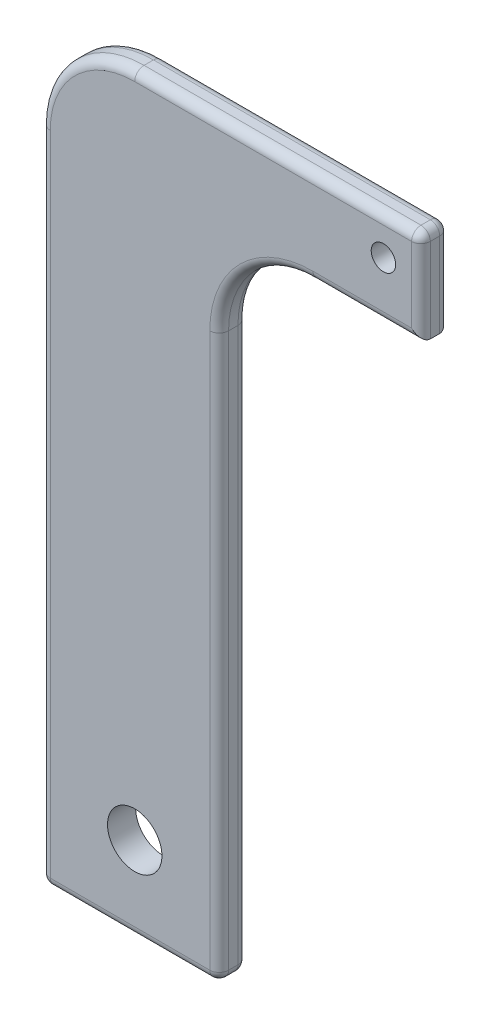
ISO-10303-21;
HEADER;
FILE_DESCRIPTION(('STEP AP214'),'2;1');
FILE_NAME('part.step','',(''),(''),'','','');
FILE_SCHEMA(('AUTOMOTIVE_DESIGN { 1 0 10303 214 1 1 1 1 }'));
ENDSEC;
DATA;
#1=APPLICATION_CONTEXT('core data for automotive mechanical design processes');
#2=APPLICATION_PROTOCOL_DEFINITION('international standard','automotive_design',2000,#1);
#3=PRODUCT_CONTEXT('',#1,'mechanical');
#4=PRODUCT('Part','Part','',(#3));
#5=PRODUCT_RELATED_PRODUCT_CATEGORY('part','',(#4));
#6=PRODUCT_DEFINITION_FORMATION('','',#4);
#7=PRODUCT_DEFINITION_CONTEXT('part definition',#1,'design');
#8=PRODUCT_DEFINITION('design','',#6,#7);
#9=PRODUCT_DEFINITION_SHAPE('','',#8);
#10=(LENGTH_UNIT() NAMED_UNIT(*) SI_UNIT(.MILLI.,.METRE.));
#11=(NAMED_UNIT(*) PLANE_ANGLE_UNIT() SI_UNIT($,.RADIAN.));
#12=(NAMED_UNIT(*) SI_UNIT($,.STERADIAN.) SOLID_ANGLE_UNIT());
#13=UNCERTAINTY_MEASURE_WITH_UNIT(LENGTH_MEASURE(1.E-05),#10,'distance_accuracy_value','');
#14=(GEOMETRIC_REPRESENTATION_CONTEXT(3) GLOBAL_UNCERTAINTY_ASSIGNED_CONTEXT((#13)) GLOBAL_UNIT_ASSIGNED_CONTEXT((#10,
#11,#12)) REPRESENTATION_CONTEXT('',''));
#15=CARTESIAN_POINT('',(0.,0.,0.));
#16=DIRECTION('',(0.,0.,1.));
#17=DIRECTION('',(1.,0.,0.));
#18=AXIS2_PLACEMENT_3D('',#15,#16,#17);
#19=CARTESIAN_POINT('',(0.,0.,26.));
#20=DIRECTION('',(-1.,0.,0.));
#21=DIRECTION('',(0.,-1.,0.));
#22=AXIS2_PLACEMENT_3D('',#19,#20,#21);
#23=PLANE('',#22);
#24=DIRECTION('',(0.,0.,-1.));
#25=VECTOR('',#24,1.);
#26=CARTESIAN_POINT('',(0.,147.,23.));
#27=LINE('',#26,#25);
#28=CARTESIAN_POINT('',(0.,147.,25.));
#29=VERTEX_POINT('',#28);
#30=CARTESIAN_POINT('',(0.,147.,24.));
#31=VERTEX_POINT('',#30);
#32=EDGE_CURVE('E245',#29,#31,#27,.T.);
#33=ORIENTED_EDGE('',*,*,#32,.T.);
#34=DIRECTION('',(0.,1.,0.));
#35=VECTOR('',#34,1.);
#36=CARTESIAN_POINT('',(0.,77.,24.));
#37=LINE('',#36,#35);
#38=CARTESIAN_POINT('',(0.,78.,24.));
#39=VERTEX_POINT('',#38);
#40=EDGE_CURVE('E263',#31,#39,#37,.F.);
#41=ORIENTED_EDGE('',*,*,#40,.T.);
#42=DIRECTION('',(0.,0.,-1.));
#43=VECTOR('',#42,1.);
#44=CARTESIAN_POINT('',(0.,78.,26.));
#45=LINE('',#44,#43);
#46=CARTESIAN_POINT('',(0.,78.,25.));
#47=VERTEX_POINT('',#46);
#48=EDGE_CURVE('E259',#39,#47,#45,.F.);
#49=ORIENTED_EDGE('',*,*,#48,.T.);
#50=DIRECTION('',(0.,1.,0.));
#51=VECTOR('',#50,1.);
#52=CARTESIAN_POINT('',(0.,0.,25.));
#53=LINE('',#52,#51);
#54=EDGE_CURVE('E261',#47,#29,#53,.T.);
#55=ORIENTED_EDGE('',*,*,#54,.T.);
#56=EDGE_LOOP('',(#33,#41,#49,#55));
#57=FACE_BOUND('',#56,.T.);
#58=ADVANCED_FACE('F39',(#57),#23,.T.);
#59=CARTESIAN_POINT('',(0.,77.,26.));
#60=DIRECTION('',(0.,1.,0.));
#61=DIRECTION('',(0.,0.,1.));
#62=AXIS2_PLACEMENT_3D('',#59,#60,#61);
#63=PLANE('',#62);
#64=DIRECTION('',(1.,0.,0.));
#65=VECTOR('',#64,1.);
#66=CARTESIAN_POINT('',(0.,77.,25.));
#67=LINE('',#66,#65);
#68=CARTESIAN_POINT('',(18.,77.,25.));
#69=VERTEX_POINT('',#68);
#70=CARTESIAN_POINT('',(1.,77.,25.));
#71=VERTEX_POINT('',#70);
#72=EDGE_CURVE('E298',#69,#71,#67,.F.);
#73=ORIENTED_EDGE('',*,*,#72,.T.);
#74=DIRECTION('',(0.,0.,-1.));
#75=VECTOR('',#74,1.);
#76=CARTESIAN_POINT('',(1.,77.,23.));
#77=LINE('',#76,#75);
#78=CARTESIAN_POINT('',(1.,77.,24.));
#79=VERTEX_POINT('',#78);
#80=EDGE_CURVE('E304',#71,#79,#77,.T.);
#81=ORIENTED_EDGE('',*,*,#80,.T.);
#82=DIRECTION('',(1.,0.,0.));
#83=VECTOR('',#82,1.);
#84=CARTESIAN_POINT('',(0.,77.,24.));
#85=LINE('',#84,#83);
#86=CARTESIAN_POINT('',(18.,77.,24.));
#87=VERTEX_POINT('',#86);
#88=EDGE_CURVE('E302',#79,#87,#85,.T.);
#89=ORIENTED_EDGE('',*,*,#88,.T.);
#90=DIRECTION('',(0.,0.,-1.));
#91=VECTOR('',#90,1.);
#92=CARTESIAN_POINT('',(18.,77.,26.));
#93=LINE('',#92,#91);
#94=EDGE_CURVE('E300',#87,#69,#93,.F.);
#95=ORIENTED_EDGE('',*,*,#94,.T.);
#96=EDGE_LOOP('',(#73,#81,#89,#95));
#97=FACE_BOUND('',#96,.T.);
#98=ADVANCED_FACE('F478',(#97),#63,.F.);
#99=CARTESIAN_POINT('',(19.,0.,26.));
#100=DIRECTION('',(-1.,0.,0.));
#101=DIRECTION('',(0.,-1.,0.));
#102=AXIS2_PLACEMENT_3D('',#99,#100,#101);
#103=PLANE('',#102);
#104=DIRECTION('',(0.,0.,-1.));
#105=VECTOR('',#104,1.);
#106=CARTESIAN_POINT('',(19.,78.,26.));
#107=LINE('',#106,#105);
#108=CARTESIAN_POINT('',(19.,78.,25.));
#109=VERTEX_POINT('',#108);
#110=CARTESIAN_POINT('',(19.,78.,24.));
#111=VERTEX_POINT('',#110);
#112=EDGE_CURVE('E275',#109,#111,#107,.T.);
#113=ORIENTED_EDGE('',*,*,#112,.T.);
#114=DIRECTION('',(0.,1.,0.));
#115=VECTOR('',#114,1.);
#116=CARTESIAN_POINT('',(19.,0.,24.));
#117=LINE('',#116,#115);
#118=CARTESIAN_POINT('',(19.,137.,24.));
#119=VERTEX_POINT('',#118);
#120=EDGE_CURVE('E279',#111,#119,#117,.T.);
#121=ORIENTED_EDGE('',*,*,#120,.T.);
#122=DIRECTION('',(0.,0.,-1.));
#123=VECTOR('',#122,1.);
#124=CARTESIAN_POINT('',(19.,137.,26.));
#125=LINE('',#124,#123);
#126=CARTESIAN_POINT('',(19.,137.,25.));
#127=VERTEX_POINT('',#126);
#128=EDGE_CURVE('E242',#119,#127,#125,.F.);
#129=ORIENTED_EDGE('',*,*,#128,.T.);
#130=DIRECTION('',(0.,1.,0.));
#131=VECTOR('',#130,1.);
#132=CARTESIAN_POINT('',(19.,77.,25.));
#133=LINE('',#132,#131);
#134=EDGE_CURVE('E277',#127,#109,#133,.F.);
#135=ORIENTED_EDGE('',*,*,#134,.T.);
#136=EDGE_LOOP('',(#113,#121,#129,#135));
#137=FACE_BOUND('',#136,.T.);
#138=ADVANCED_FACE('F401',(#137),#103,.F.);
#139=CARTESIAN_POINT('',(0.,147.,26.));
#140=DIRECTION('',(0.,1.,0.));
#141=DIRECTION('',(0.,0.,1.));
#142=AXIS2_PLACEMENT_3D('',#139,#140,#141);
#143=PLANE('',#142);
#144=DIRECTION('',(0.,0.,-1.));
#145=VECTOR('',#144,1.);
#146=CARTESIAN_POINT('',(29.,147.,23.));
#147=LINE('',#146,#145);
#148=CARTESIAN_POINT('',(29.,147.,25.));
#149=VERTEX_POINT('',#148);
#150=CARTESIAN_POINT('',(29.,147.,24.));
#151=VERTEX_POINT('',#150);
#152=EDGE_CURVE('E239',#149,#151,#147,.T.);
#153=ORIENTED_EDGE('',*,*,#152,.T.);
#154=DIRECTION('',(1.,0.,0.));
#155=VECTOR('',#154,1.);
#156=CARTESIAN_POINT('',(0.,147.,24.));
#157=LINE('',#156,#155);
#158=CARTESIAN_POINT('',(40.5,147.,24.));
#159=VERTEX_POINT('',#158);
#160=EDGE_CURVE('E197',#151,#159,#157,.T.);
#161=ORIENTED_EDGE('',*,*,#160,.T.);
#162=DIRECTION('',(0.,0.,-1.));
#163=VECTOR('',#162,1.);
#164=CARTESIAN_POINT('',(40.5,147.,26.));
#165=LINE('',#164,#163);
#166=CARTESIAN_POINT('',(40.5,147.,25.));
#167=VERTEX_POINT('',#166);
#168=EDGE_CURVE('E237',#167,#159,#165,.T.);
#169=ORIENTED_EDGE('',*,*,#168,.F.);
#170=DIRECTION('',(1.,0.,0.));
#171=VECTOR('',#170,1.);
#172=CARTESIAN_POINT('',(29.,147.,25.));
#173=LINE('',#172,#171);
#174=EDGE_CURVE('E272',#167,#149,#173,.F.);
#175=ORIENTED_EDGE('',*,*,#174,.T.);
#176=EDGE_LOOP('',(#153,#161,#169,#175));
#177=FACE_BOUND('',#176,.T.);
#178=ADVANCED_FACE('F389',(#177),#143,.F.);
#179=CARTESIAN_POINT('',(40.5,0.,26.));
#180=DIRECTION('',(-1.,0.,0.));
#181=DIRECTION('',(0.,0.,1.));
#182=AXIS2_PLACEMENT_3D('',#179,#180,#181);
#183=PLANE('',#182);
#184=ORIENTED_EDGE('',*,*,#168,.T.);
#185=DIRECTION('',(0.,1.,0.));
#186=VECTOR('',#185,1.);
#187=CARTESIAN_POINT('',(40.5,0.,24.));
#188=LINE('',#187,#186);
#189=CARTESIAN_POINT('',(40.5,156.,24.));
#190=VERTEX_POINT('',#189);
#191=EDGE_CURVE('E56',#159,#190,#188,.T.);
#192=ORIENTED_EDGE('',*,*,#191,.T.);
#193=DIRECTION('',(0.,0.,-1.));
#194=VECTOR('',#193,1.);
#195=CARTESIAN_POINT('',(40.5,156.,26.));
#196=LINE('',#195,#194);
#197=CARTESIAN_POINT('',(40.5,156.,25.));
#198=VERTEX_POINT('',#197);
#199=EDGE_CURVE('E60',#190,#198,#196,.F.);
#200=ORIENTED_EDGE('',*,*,#199,.T.);
#201=DIRECTION('',(0.,1.,0.));
#202=VECTOR('',#201,1.);
#203=CARTESIAN_POINT('',(40.5,147.,25.));
#204=LINE('',#203,#202);
#205=EDGE_CURVE('E307',#198,#167,#204,.F.);
#206=ORIENTED_EDGE('',*,*,#205,.T.);
#207=EDGE_LOOP('',(#184,#192,#200,#206));
#208=FACE_BOUND('',#207,.T.);
#209=ADVANCED_FACE('F387',(#208),#183,.F.);
#210=CARTESIAN_POINT('',(10.,86.,26.));
#211=DIRECTION('',(0.,0.,-1.));
#212=DIRECTION('',(-1.,0.,0.));
#213=AXIS2_PLACEMENT_3D('',#210,#211,#212);
#214=CYLINDRICAL_SURFACE('',#213,2.9);
#215=CARTESIAN_POINT('',(10.,86.,26.));
#216=DIRECTION('',(0.,0.,1.));
#217=DIRECTION('',(1.,0.,0.));
#218=AXIS2_PLACEMENT_3D('',#215,#216,#217);
#219=CIRCLE('',#218,2.9);
#220=CARTESIAN_POINT('',(12.9,86.,26.));
#221=VERTEX_POINT('',#220);
#222=EDGE_CURVE('E231',#221,#221,#219,.F.);
#223=ORIENTED_EDGE('',*,*,#222,.F.);
#224=EDGE_LOOP('',(#223));
#225=FACE_BOUND('',#224,.T.);
#226=CARTESIAN_POINT('',(10.,86.,23.));
#227=DIRECTION('',(0.,0.,1.));
#228=DIRECTION('',(1.,0.,0.));
#229=AXIS2_PLACEMENT_3D('',#226,#227,#228);
#230=CIRCLE('',#229,2.9);
#231=CARTESIAN_POINT('',(12.9,86.,23.));
#232=VERTEX_POINT('',#231);
#233=EDGE_CURVE('E220',#232,#232,#230,.F.);
#234=ORIENTED_EDGE('',*,*,#233,.T.);
#235=EDGE_LOOP('',(#234));
#236=FACE_BOUND('',#235,.T.);
#237=ADVANCED_FACE('F780',(#225,#236),#214,.F.);
#238=CARTESIAN_POINT('',(0.,157.,26.));
#239=DIRECTION('',(0.,-1.,0.));
#240=DIRECTION('',(0.,0.,-1.));
#241=AXIS2_PLACEMENT_3D('',#238,#239,#240);
#242=PLANE('',#241);
#243=DIRECTION('',(0.,0.,-1.));
#244=VECTOR('',#243,1.);
#245=CARTESIAN_POINT('',(39.5,157.,26.));
#246=LINE('',#245,#244);
#247=CARTESIAN_POINT('',(39.5,157.,25.));
#248=VERTEX_POINT('',#247);
#249=CARTESIAN_POINT('',(39.5,157.,24.));
#250=VERTEX_POINT('',#249);
#251=EDGE_CURVE('E266',#248,#250,#246,.T.);
#252=ORIENTED_EDGE('',*,*,#251,.T.);
#253=DIRECTION('',(-1.,0.,0.));
#254=VECTOR('',#253,1.);
#255=CARTESIAN_POINT('',(0.,157.,24.));
#256=LINE('',#255,#254);
#257=CARTESIAN_POINT('',(10.,157.,24.));
#258=VERTEX_POINT('',#257);
#259=EDGE_CURVE('E270',#250,#258,#256,.T.);
#260=ORIENTED_EDGE('',*,*,#259,.T.);
#261=DIRECTION('',(0.,0.,-1.));
#262=VECTOR('',#261,1.);
#263=CARTESIAN_POINT('',(10.,157.,26.));
#264=LINE('',#263,#262);
#265=CARTESIAN_POINT('',(10.,157.,25.));
#266=VERTEX_POINT('',#265);
#267=EDGE_CURVE('E193',#258,#266,#264,.F.);
#268=ORIENTED_EDGE('',*,*,#267,.T.);
#269=DIRECTION('',(-1.,0.,0.));
#270=VECTOR('',#269,1.);
#271=CARTESIAN_POINT('',(40.5,157.,25.));
#272=LINE('',#271,#270);
#273=EDGE_CURVE('E268',#266,#248,#272,.F.);
#274=ORIENTED_EDGE('',*,*,#273,.T.);
#275=EDGE_LOOP('',(#252,#260,#268,#274));
#276=FACE_BOUND('',#275,.T.);
#277=ADVANCED_FACE('F445',(#276),#242,.F.);
#278=CARTESIAN_POINT('',(36.5,153.,26.));
#279=DIRECTION('',(0.,0.,-1.));
#280=DIRECTION('',(-1.,0.,0.));
#281=AXIS2_PLACEMENT_3D('',#278,#279,#280);
#282=CYLINDRICAL_SURFACE('',#281,1.3);
#283=CARTESIAN_POINT('',(36.5,153.,26.));
#284=DIRECTION('',(0.,0.,1.));
#285=DIRECTION('',(1.,0.,0.));
#286=AXIS2_PLACEMENT_3D('',#283,#284,#285);
#287=CIRCLE('',#286,1.3);
#288=CARTESIAN_POINT('',(37.8,153.,26.));
#289=VERTEX_POINT('',#288);
#290=EDGE_CURVE('E234',#289,#289,#287,.T.);
#291=ORIENTED_EDGE('',*,*,#290,.T.);
#292=EDGE_LOOP('',(#291));
#293=FACE_BOUND('',#292,.T.);
#294=CARTESIAN_POINT('',(36.5,153.,23.));
#295=DIRECTION('',(0.,0.,1.));
#296=DIRECTION('',(1.,0.,0.));
#297=AXIS2_PLACEMENT_3D('',#294,#295,#296);
#298=CIRCLE('',#297,1.3);
#299=CARTESIAN_POINT('',(37.8,153.,23.));
#300=VERTEX_POINT('',#299);
#301=EDGE_CURVE('E226',#300,#300,#298,.T.);
#302=ORIENTED_EDGE('',*,*,#301,.F.);
#303=EDGE_LOOP('',(#302));
#304=FACE_BOUND('',#303,.T.);
#305=ADVANCED_FACE('F768',(#293,#304),#282,.F.);
#306=CARTESIAN_POINT('',(0.,0.,26.));
#307=DIRECTION('',(0.,0.,1.));
#308=DIRECTION('',(1.,0.,0.));
#309=AXIS2_PLACEMENT_3D('',#306,#307,#308);
#310=PLANE('',#309);
#311=DIRECTION('',(-1.,0.,0.));
#312=VECTOR('',#311,1.);
#313=CARTESIAN_POINT('',(10.,156.,26.));
#314=LINE('',#313,#312);
#315=CARTESIAN_POINT('',(39.5,156.,26.));
#316=VERTEX_POINT('',#315);
#317=CARTESIAN_POINT('',(10.,156.,26.));
#318=VERTEX_POINT('',#317);
#319=EDGE_CURVE('E293',#316,#318,#314,.T.);
#320=ORIENTED_EDGE('',*,*,#319,.T.);
#321=CARTESIAN_POINT('',(10.,147.,26.));
#322=DIRECTION('',(0.,0.,1.));
#323=DIRECTION('',(1.,0.,0.));
#324=AXIS2_PLACEMENT_3D('',#321,#322,#323);
#325=CIRCLE('',#324,9.);
#326=CARTESIAN_POINT('',(0.999999999999996,147.,26.));
#327=VERTEX_POINT('',#326);
#328=EDGE_CURVE('E296',#318,#327,#325,.T.);
#329=ORIENTED_EDGE('',*,*,#328,.T.);
#330=DIRECTION('',(0.,1.,0.));
#331=VECTOR('',#330,1.);
#332=CARTESIAN_POINT('',(1.,0.,26.));
#333=LINE('',#332,#331);
#334=CARTESIAN_POINT('',(1.,78.,26.));
#335=VERTEX_POINT('',#334);
#336=EDGE_CURVE('E291',#327,#335,#333,.F.);
#337=ORIENTED_EDGE('',*,*,#336,.T.);
#338=DIRECTION('',(1.,0.,0.));
#339=VECTOR('',#338,1.);
#340=CARTESIAN_POINT('',(19.,78.,26.));
#341=LINE('',#340,#339);
#342=CARTESIAN_POINT('',(18.,78.,26.));
#343=VERTEX_POINT('',#342);
#344=EDGE_CURVE('E289',#335,#343,#341,.T.);
#345=ORIENTED_EDGE('',*,*,#344,.T.);
#346=DIRECTION('',(0.,1.,0.));
#347=VECTOR('',#346,1.);
#348=CARTESIAN_POINT('',(18.,137.,26.));
#349=LINE('',#348,#347);
#350=CARTESIAN_POINT('',(18.,137.,26.));
#351=VERTEX_POINT('',#350);
#352=EDGE_CURVE('E285',#343,#351,#349,.T.);
#353=ORIENTED_EDGE('',*,*,#352,.T.);
#354=CARTESIAN_POINT('',(29.,137.,26.));
#355=DIRECTION('',(0.,0.,1.));
#356=DIRECTION('',(1.,0.,0.));
#357=AXIS2_PLACEMENT_3D('',#354,#355,#356);
#358=CIRCLE('',#357,11.);
#359=CARTESIAN_POINT('',(29.,148.,26.));
#360=VERTEX_POINT('',#359);
#361=EDGE_CURVE('E281',#351,#360,#358,.F.);
#362=ORIENTED_EDGE('',*,*,#361,.T.);
#363=DIRECTION('',(1.,0.,0.));
#364=VECTOR('',#363,1.);
#365=CARTESIAN_POINT('',(40.5,148.,26.));
#366=LINE('',#365,#364);
#367=CARTESIAN_POINT('',(39.5,148.,26.));
#368=VERTEX_POINT('',#367);
#369=EDGE_CURVE('E283',#360,#368,#366,.T.);
#370=ORIENTED_EDGE('',*,*,#369,.T.);
#371=DIRECTION('',(0.,1.,0.));
#372=VECTOR('',#371,1.);
#373=CARTESIAN_POINT('',(39.5,157.,26.));
#374=LINE('',#373,#372);
#375=EDGE_CURVE('E287',#368,#316,#374,.T.);
#376=ORIENTED_EDGE('',*,*,#375,.T.);
#377=EDGE_LOOP('',(#320,#329,#337,#345,#353,#362,#370,#376));
#378=FACE_BOUND('',#377,.T.);
#379=ORIENTED_EDGE('',*,*,#222,.T.);
#380=EDGE_LOOP('',(#379));
#381=FACE_BOUND('',#380,.T.);
#382=ORIENTED_EDGE('',*,*,#290,.F.);
#383=EDGE_LOOP('',(#382));
#384=FACE_BOUND('',#383,.T.);
#385=ADVANCED_FACE('F392',(#378,#381,#384),#310,.T.);
#386=CARTESIAN_POINT('',(0.,0.,23.));
#387=DIRECTION('',(0.,0.,1.));
#388=DIRECTION('',(1.,0.,0.));
#389=AXIS2_PLACEMENT_3D('',#386,#387,#388);
#390=PLANE('',#389);
#391=DIRECTION('',(0.,1.,0.));
#392=VECTOR('',#391,1.);
#393=CARTESIAN_POINT('',(0.999999999999996,147.,23.));
#394=LINE('',#393,#392);
#395=CARTESIAN_POINT('',(1.,78.,23.));
#396=VERTEX_POINT('',#395);
#397=CARTESIAN_POINT('',(0.999999999999996,147.,23.));
#398=VERTEX_POINT('',#397);
#399=EDGE_CURVE('E255',#396,#398,#394,.T.);
#400=ORIENTED_EDGE('',*,*,#399,.T.);
#401=CARTESIAN_POINT('',(10.,147.,23.));
#402=DIRECTION('',(0.,0.,1.));
#403=DIRECTION('',(1.,0.,0.));
#404=AXIS2_PLACEMENT_3D('',#401,#402,#403);
#405=CIRCLE('',#404,9.);
#406=CARTESIAN_POINT('',(10.,156.,23.));
#407=VERTEX_POINT('',#406);
#408=EDGE_CURVE('E257',#398,#407,#405,.F.);
#409=ORIENTED_EDGE('',*,*,#408,.T.);
#410=DIRECTION('',(-1.,0.,0.));
#411=VECTOR('',#410,1.);
#412=CARTESIAN_POINT('',(0.,156.,23.));
#413=LINE('',#412,#411);
#414=CARTESIAN_POINT('',(39.5,156.,23.));
#415=VERTEX_POINT('',#414);
#416=EDGE_CURVE('E253',#407,#415,#413,.F.);
#417=ORIENTED_EDGE('',*,*,#416,.T.);
#418=DIRECTION('',(0.,1.,0.));
#419=VECTOR('',#418,1.);
#420=CARTESIAN_POINT('',(39.5,0.,23.));
#421=LINE('',#420,#419);
#422=CARTESIAN_POINT('',(39.5,148.,23.));
#423=VERTEX_POINT('',#422);
#424=EDGE_CURVE('E176',#415,#423,#421,.F.);
#425=ORIENTED_EDGE('',*,*,#424,.T.);
#426=DIRECTION('',(1.,0.,0.));
#427=VECTOR('',#426,1.);
#428=CARTESIAN_POINT('',(0.,148.,23.));
#429=LINE('',#428,#427);
#430=CARTESIAN_POINT('',(29.,148.,23.));
#431=VERTEX_POINT('',#430);
#432=EDGE_CURVE('E168',#423,#431,#429,.F.);
#433=ORIENTED_EDGE('',*,*,#432,.T.);
#434=CARTESIAN_POINT('',(29.,137.,23.));
#435=DIRECTION('',(0.,0.,1.));
#436=DIRECTION('',(1.,0.,0.));
#437=AXIS2_PLACEMENT_3D('',#434,#435,#436);
#438=CIRCLE('',#437,11.);
#439=CARTESIAN_POINT('',(18.,137.,23.));
#440=VERTEX_POINT('',#439);
#441=EDGE_CURVE('E173',#431,#440,#438,.T.);
#442=ORIENTED_EDGE('',*,*,#441,.T.);
#443=DIRECTION('',(0.,1.,0.));
#444=VECTOR('',#443,1.);
#445=CARTESIAN_POINT('',(18.,0.,23.));
#446=LINE('',#445,#444);
#447=CARTESIAN_POINT('',(18.,78.,23.));
#448=VERTEX_POINT('',#447);
#449=EDGE_CURVE('E182',#440,#448,#446,.F.);
#450=ORIENTED_EDGE('',*,*,#449,.T.);
#451=DIRECTION('',(1.,0.,0.));
#452=VECTOR('',#451,1.);
#453=CARTESIAN_POINT('',(0.,78.,23.));
#454=LINE('',#453,#452);
#455=EDGE_CURVE('E181',#448,#396,#454,.F.);
#456=ORIENTED_EDGE('',*,*,#455,.T.);
#457=EDGE_LOOP('',(#400,#409,#417,#425,#433,#442,#450,#456));
#458=FACE_BOUND('',#457,.T.);
#459=ORIENTED_EDGE('',*,*,#233,.F.);
#460=EDGE_LOOP('',(#459));
#461=FACE_BOUND('',#460,.T.);
#462=ORIENTED_EDGE('',*,*,#301,.T.);
#463=EDGE_LOOP('',(#462));
#464=FACE_BOUND('',#463,.T.);
#465=ADVANCED_FACE('F171',(#458,#461,#464),#390,.F.);
#466=CARTESIAN_POINT('',(29.,137.,26.));
#467=DIRECTION('',(0.,0.,1.));
#468=DIRECTION('',(1.,0.,0.));
#469=AXIS2_PLACEMENT_3D('',#466,#467,#468);
#470=CYLINDRICAL_SURFACE('',#469,10.);
#471=ORIENTED_EDGE('',*,*,#128,.F.);
#472=CARTESIAN_POINT('',(29.,137.,24.));
#473=DIRECTION('',(0.,0.,1.));
#474=DIRECTION('',(1.,0.,0.));
#475=AXIS2_PLACEMENT_3D('',#472,#473,#474);
#476=CIRCLE('',#475,10.);
#477=EDGE_CURVE('E11',#119,#151,#476,.F.);
#478=ORIENTED_EDGE('',*,*,#477,.T.);
#479=ORIENTED_EDGE('',*,*,#152,.F.);
#480=CARTESIAN_POINT('',(29.,137.,25.));
#481=DIRECTION('',(0.,0.,1.));
#482=DIRECTION('',(1.,0.,0.));
#483=AXIS2_PLACEMENT_3D('',#480,#481,#482);
#484=CIRCLE('',#483,10.);
#485=EDGE_CURVE('E48',#149,#127,#484,.T.);
#486=ORIENTED_EDGE('',*,*,#485,.T.);
#487=EDGE_LOOP('',(#471,#478,#479,#486));
#488=FACE_BOUND('',#487,.T.);
#489=ADVANCED_FACE('F399',(#488),#470,.F.);
#490=CARTESIAN_POINT('',(10.,147.,26.));
#491=DIRECTION('',(0.,0.,1.));
#492=DIRECTION('',(1.,0.,0.));
#493=AXIS2_PLACEMENT_3D('',#490,#491,#492);
#494=CYLINDRICAL_SURFACE('',#493,10.);
#495=ORIENTED_EDGE('',*,*,#267,.F.);
#496=CARTESIAN_POINT('',(10.,147.,24.));
#497=DIRECTION('',(0.,0.,1.));
#498=DIRECTION('',(1.,0.,0.));
#499=AXIS2_PLACEMENT_3D('',#496,#497,#498);
#500=CIRCLE('',#499,10.);
#501=EDGE_CURVE('E313',#258,#31,#500,.T.);
#502=ORIENTED_EDGE('',*,*,#501,.T.);
#503=ORIENTED_EDGE('',*,*,#32,.F.);
#504=CARTESIAN_POINT('',(10.,147.,25.));
#505=DIRECTION('',(0.,0.,1.));
#506=DIRECTION('',(1.,0.,0.));
#507=AXIS2_PLACEMENT_3D('',#504,#505,#506);
#508=CIRCLE('',#507,10.);
#509=EDGE_CURVE('E311',#29,#266,#508,.F.);
#510=ORIENTED_EDGE('',*,*,#509,.T.);
#511=EDGE_LOOP('',(#495,#502,#503,#510));
#512=FACE_BOUND('',#511,.T.);
#513=ADVANCED_FACE('F448',(#512),#494,.T.);
#514=CARTESIAN_POINT('',(29.,137.,25.));
#515=DIRECTION('',(0.,0.,1.));
#516=DIRECTION('',(1.,0.,0.));
#517=AXIS2_PLACEMENT_3D('',#514,#515,#516);
#518=TOROIDAL_SURFACE('',#517,11.,1.);
#519=CARTESIAN_POINT('',(18.,137.,25.));
#520=DIRECTION('',(0.,-1.,0.));
#521=DIRECTION('',(0.,0.,-1.));
#522=AXIS2_PLACEMENT_3D('',#519,#520,#521);
#523=CIRCLE('',#522,1.);
#524=EDGE_CURVE('E213',#127,#351,#523,.T.);
#525=ORIENTED_EDGE('',*,*,#524,.F.);
#526=ORIENTED_EDGE('',*,*,#485,.F.);
#527=CARTESIAN_POINT('',(29.,148.,25.));
#528=DIRECTION('',(1.,0.,0.));
#529=DIRECTION('',(0.,0.,-1.));
#530=AXIS2_PLACEMENT_3D('',#527,#528,#529);
#531=CIRCLE('',#530,1.);
#532=EDGE_CURVE('E43',#360,#149,#531,.T.);
#533=ORIENTED_EDGE('',*,*,#532,.F.);
#534=ORIENTED_EDGE('',*,*,#361,.F.);
#535=EDGE_LOOP('',(#525,#526,#533,#534));
#536=FACE_BOUND('',#535,.T.);
#537=ADVANCED_FACE('F41',(#536),#518,.T.);
#538=CARTESIAN_POINT('',(0.,148.,25.));
#539=DIRECTION('',(-1.,0.,0.));
#540=DIRECTION('',(0.,0.,1.));
#541=AXIS2_PLACEMENT_3D('',#538,#539,#540);
#542=CYLINDRICAL_SURFACE('',#541,1.);
#543=ORIENTED_EDGE('',*,*,#532,.T.);
#544=ORIENTED_EDGE('',*,*,#174,.F.);
#545=CARTESIAN_POINT('',(39.5,148.,25.));
#546=DIRECTION('',(-0.707106781186547,-0.707106781186547,0.));
#547=DIRECTION('',(0.707106781186547,-0.707106781186547,0.));
#548=AXIS2_PLACEMENT_3D('',#545,#546,#547);
#549=ELLIPSE('',#548,1.41421356237309,1.);
#550=EDGE_CURVE('E211',#368,#167,#549,.F.);
#551=ORIENTED_EDGE('',*,*,#550,.F.);
#552=ORIENTED_EDGE('',*,*,#369,.F.);
#553=EDGE_LOOP('',(#543,#544,#551,#552));
#554=FACE_BOUND('',#553,.T.);
#555=ADVANCED_FACE('F391',(#554),#542,.T.);
#556=CARTESIAN_POINT('',(18.,0.,25.));
#557=DIRECTION('',(0.,-1.,0.));
#558=DIRECTION('',(1.,0.,0.));
#559=AXIS2_PLACEMENT_3D('',#556,#557,#558);
#560=CYLINDRICAL_SURFACE('',#559,1.);
#561=ORIENTED_EDGE('',*,*,#524,.T.);
#562=ORIENTED_EDGE('',*,*,#352,.F.);
#563=CARTESIAN_POINT('',(18.,78.,25.));
#564=DIRECTION('',(0.,-1.,0.));
#565=DIRECTION('',(0.,0.,-1.));
#566=AXIS2_PLACEMENT_3D('',#563,#564,#565);
#567=CIRCLE('',#566,1.);
#568=EDGE_CURVE('E198',#109,#343,#567,.T.);
#569=ORIENTED_EDGE('',*,*,#568,.F.);
#570=ORIENTED_EDGE('',*,*,#134,.F.);
#571=EDGE_LOOP('',(#561,#562,#569,#570));
#572=FACE_BOUND('',#571,.T.);
#573=ADVANCED_FACE('F469',(#572),#560,.T.);
#574=CARTESIAN_POINT('',(39.5,0.,25.));
#575=DIRECTION('',(0.,-1.,0.));
#576=DIRECTION('',(0.,0.,-1.));
#577=AXIS2_PLACEMENT_3D('',#574,#575,#576);
#578=CYLINDRICAL_SURFACE('',#577,1.);
#579=ORIENTED_EDGE('',*,*,#550,.T.);
#580=ORIENTED_EDGE('',*,*,#205,.F.);
#581=CARTESIAN_POINT('',(39.5,156.,25.));
#582=DIRECTION('',(0.,1.,0.));
#583=DIRECTION('',(0.,0.,1.));
#584=AXIS2_PLACEMENT_3D('',#581,#582,#583);
#585=CIRCLE('',#584,1.);
#586=EDGE_CURVE('E199',#316,#198,#585,.T.);
#587=ORIENTED_EDGE('',*,*,#586,.F.);
#588=ORIENTED_EDGE('',*,*,#375,.F.);
#589=EDGE_LOOP('',(#579,#580,#587,#588));
#590=FACE_BOUND('',#589,.T.);
#591=ADVANCED_FACE('F384',(#590),#578,.T.);
#592=CARTESIAN_POINT('',(0.,156.,25.));
#593=DIRECTION('',(1.,0.,0.));
#594=DIRECTION('',(0.,0.,-1.));
#595=AXIS2_PLACEMENT_3D('',#592,#593,#594);
#596=CYLINDRICAL_SURFACE('',#595,1.);
#597=CARTESIAN_POINT('',(39.5,156.,25.));
#598=DIRECTION('',(1.,0.,0.));
#599=DIRECTION('',(0.,0.,-1.));
#600=AXIS2_PLACEMENT_3D('',#597,#598,#599);
#601=CIRCLE('',#600,1.);
#602=EDGE_CURVE('E205',#248,#316,#601,.T.);
#603=ORIENTED_EDGE('',*,*,#602,.F.);
#604=ORIENTED_EDGE('',*,*,#273,.F.);
#605=CARTESIAN_POINT('',(10.,156.,25.));
#606=DIRECTION('',(-1.,0.,0.));
#607=DIRECTION('',(0.,0.,1.));
#608=AXIS2_PLACEMENT_3D('',#605,#606,#607);
#609=CIRCLE('',#608,1.);
#610=EDGE_CURVE('E202',#318,#266,#609,.T.);
#611=ORIENTED_EDGE('',*,*,#610,.F.);
#612=ORIENTED_EDGE('',*,*,#319,.F.);
#613=EDGE_LOOP('',(#603,#604,#611,#612));
#614=FACE_BOUND('',#613,.T.);
#615=ADVANCED_FACE('F379',(#614),#596,.T.);
#616=CARTESIAN_POINT('',(10.,147.,25.));
#617=DIRECTION('',(0.,0.,1.));
#618=DIRECTION('',(1.,0.,0.));
#619=AXIS2_PLACEMENT_3D('',#616,#617,#618);
#620=TOROIDAL_SURFACE('',#619,9.,1.);
#621=ORIENTED_EDGE('',*,*,#610,.T.);
#622=ORIENTED_EDGE('',*,*,#509,.F.);
#623=CARTESIAN_POINT('',(0.999999999999996,147.,25.));
#624=DIRECTION('',(0.,-1.,0.));
#625=DIRECTION('',(0.,0.,-1.));
#626=AXIS2_PLACEMENT_3D('',#623,#624,#625);
#627=CIRCLE('',#626,1.);
#628=EDGE_CURVE('E367',#327,#29,#627,.T.);
#629=ORIENTED_EDGE('',*,*,#628,.F.);
#630=ORIENTED_EDGE('',*,*,#328,.F.);
#631=EDGE_LOOP('',(#621,#622,#629,#630));
#632=FACE_BOUND('',#631,.T.);
#633=ADVANCED_FACE('F453',(#632),#620,.T.);
#634=CARTESIAN_POINT('',(18.,78.,25.));
#635=DIRECTION('',(0.,0.,1.));
#636=DIRECTION('',(1.,0.,0.));
#637=AXIS2_PLACEMENT_3D('',#634,#635,#636);
#638=SPHERICAL_SURFACE('',#637,1.);
#639=CARTESIAN_POINT('',(18.,78.,25.));
#640=DIRECTION('',(0.,0.,1.));
#641=DIRECTION('',(1.,0.,0.));
#642=AXIS2_PLACEMENT_3D('',#639,#640,#641);
#643=CIRCLE('',#642,1.);
#644=EDGE_CURVE('E361',#109,#69,#643,.F.);
#645=ORIENTED_EDGE('',*,*,#644,.F.);
#646=ORIENTED_EDGE('',*,*,#568,.T.);
#647=CARTESIAN_POINT('',(18.,78.,25.));
#648=DIRECTION('',(1.,0.,0.));
#649=DIRECTION('',(0.,0.,-1.));
#650=AXIS2_PLACEMENT_3D('',#647,#648,#649);
#651=CIRCLE('',#650,1.);
#652=EDGE_CURVE('E364',#69,#343,#651,.F.);
#653=ORIENTED_EDGE('',*,*,#652,.F.);
#654=EDGE_LOOP('',(#645,#646,#653));
#655=FACE_BOUND('',#654,.T.);
#656=ADVANCED_FACE('F468',(#655),#638,.T.);
#657=CARTESIAN_POINT('',(29.,137.,24.));
#658=DIRECTION('',(0.,0.,1.));
#659=DIRECTION('',(1.,0.,0.));
#660=AXIS2_PLACEMENT_3D('',#657,#658,#659);
#661=TOROIDAL_SURFACE('',#660,11.,1.);
#662=CARTESIAN_POINT('',(18.,137.,24.));
#663=DIRECTION('',(0.,-1.,0.));
#664=DIRECTION('',(0.,0.,-1.));
#665=AXIS2_PLACEMENT_3D('',#662,#663,#664);
#666=CIRCLE('',#665,1.);
#667=EDGE_CURVE('E191',#440,#119,#666,.T.);
#668=ORIENTED_EDGE('',*,*,#667,.F.);
#669=ORIENTED_EDGE('',*,*,#441,.F.);
#670=CARTESIAN_POINT('',(29.,148.,24.));
#671=DIRECTION('',(1.,0.,0.));
#672=DIRECTION('',(0.,0.,-1.));
#673=AXIS2_PLACEMENT_3D('',#670,#671,#672);
#674=CIRCLE('',#673,1.);
#675=EDGE_CURVE('E188',#151,#431,#674,.T.);
#676=ORIENTED_EDGE('',*,*,#675,.F.);
#677=ORIENTED_EDGE('',*,*,#477,.F.);
#678=EDGE_LOOP('',(#668,#669,#676,#677));
#679=FACE_BOUND('',#678,.T.);
#680=ADVANCED_FACE('F186',(#679),#661,.T.);
#681=CARTESIAN_POINT('',(0.,148.,24.));
#682=DIRECTION('',(1.,0.,0.));
#683=DIRECTION('',(0.,0.,-1.));
#684=AXIS2_PLACEMENT_3D('',#681,#682,#683);
#685=CYLINDRICAL_SURFACE('',#684,1.);
#686=ORIENTED_EDGE('',*,*,#675,.T.);
#687=ORIENTED_EDGE('',*,*,#432,.F.);
#688=CARTESIAN_POINT('',(39.5,148.,24.));
#689=DIRECTION('',(0.707106781186547,0.707106781186547,0.));
#690=DIRECTION('',(-0.707106781186547,0.707106781186547,0.));
#691=AXIS2_PLACEMENT_3D('',#688,#689,#690);
#692=ELLIPSE('',#691,1.41421356237309,1.);
#693=EDGE_CURVE('E358',#159,#423,#692,.T.);
#694=ORIENTED_EDGE('',*,*,#693,.F.);
#695=ORIENTED_EDGE('',*,*,#160,.F.);
#696=EDGE_LOOP('',(#686,#687,#694,#695));
#697=FACE_BOUND('',#696,.T.);
#698=ADVANCED_FACE('F195',(#697),#685,.T.);
#699=CARTESIAN_POINT('',(39.5,156.,25.));
#700=DIRECTION('',(0.,0.,1.));
#701=DIRECTION('',(1.,0.,0.));
#702=AXIS2_PLACEMENT_3D('',#699,#700,#701);
#703=SPHERICAL_SURFACE('',#702,1.);
#704=ORIENTED_EDGE('',*,*,#602,.T.);
#705=ORIENTED_EDGE('',*,*,#586,.T.);
#706=CARTESIAN_POINT('',(39.5,156.,25.));
#707=DIRECTION('',(0.,0.,1.));
#708=DIRECTION('',(1.,0.,0.));
#709=AXIS2_PLACEMENT_3D('',#706,#707,#708);
#710=CIRCLE('',#709,1.);
#711=EDGE_CURVE('E355',#248,#198,#710,.F.);
#712=ORIENTED_EDGE('',*,*,#711,.F.);
#713=EDGE_LOOP('',(#704,#705,#712));
#714=FACE_BOUND('',#713,.T.);
#715=ADVANCED_FACE('F373',(#714),#703,.T.);
#716=CARTESIAN_POINT('',(1.,0.,25.));
#717=DIRECTION('',(0.,1.,0.));
#718=DIRECTION('',(-1.,0.,0.));
#719=AXIS2_PLACEMENT_3D('',#716,#717,#718);
#720=CYLINDRICAL_SURFACE('',#719,1.);
#721=ORIENTED_EDGE('',*,*,#628,.T.);
#722=ORIENTED_EDGE('',*,*,#54,.F.);
#723=CARTESIAN_POINT('',(1.,78.,25.));
#724=DIRECTION('',(0.,-1.,0.));
#725=DIRECTION('',(0.,0.,-1.));
#726=AXIS2_PLACEMENT_3D('',#723,#724,#725);
#727=CIRCLE('',#726,1.);
#728=EDGE_CURVE('E352',#335,#47,#727,.T.);
#729=ORIENTED_EDGE('',*,*,#728,.F.);
#730=ORIENTED_EDGE('',*,*,#336,.F.);
#731=EDGE_LOOP('',(#721,#722,#729,#730));
#732=FACE_BOUND('',#731,.T.);
#733=ADVANCED_FACE('F457',(#732),#720,.T.);
#734=CARTESIAN_POINT('',(0.,78.,25.));
#735=DIRECTION('',(-1.,0.,0.));
#736=DIRECTION('',(0.,0.,1.));
#737=AXIS2_PLACEMENT_3D('',#734,#735,#736);
#738=CYLINDRICAL_SURFACE('',#737,1.);
#739=ORIENTED_EDGE('',*,*,#652,.T.);
#740=ORIENTED_EDGE('',*,*,#344,.F.);
#741=CARTESIAN_POINT('',(1.,78.,25.));
#742=DIRECTION('',(-1.,0.,0.));
#743=DIRECTION('',(0.,0.,1.));
#744=AXIS2_PLACEMENT_3D('',#741,#742,#743);
#745=CIRCLE('',#744,1.);
#746=EDGE_CURVE('E349',#71,#335,#745,.T.);
#747=ORIENTED_EDGE('',*,*,#746,.F.);
#748=ORIENTED_EDGE('',*,*,#72,.F.);
#749=EDGE_LOOP('',(#739,#740,#747,#748));
#750=FACE_BOUND('',#749,.T.);
#751=ADVANCED_FACE('F462',(#750),#738,.T.);
#752=CARTESIAN_POINT('',(18.,78.,26.));
#753=DIRECTION('',(0.,0.,-1.));
#754=DIRECTION('',(-1.,0.,0.));
#755=AXIS2_PLACEMENT_3D('',#752,#753,#754);
#756=CYLINDRICAL_SURFACE('',#755,1.);
#757=ORIENTED_EDGE('',*,*,#644,.T.);
#758=ORIENTED_EDGE('',*,*,#94,.F.);
#759=CARTESIAN_POINT('',(18.,78.,24.));
#760=DIRECTION('',(0.,0.,-1.));
#761=DIRECTION('',(-1.,0.,0.));
#762=AXIS2_PLACEMENT_3D('',#759,#760,#761);
#763=CIRCLE('',#762,1.);
#764=EDGE_CURVE('E346',#111,#87,#763,.T.);
#765=ORIENTED_EDGE('',*,*,#764,.F.);
#766=ORIENTED_EDGE('',*,*,#112,.F.);
#767=EDGE_LOOP('',(#757,#758,#765,#766));
#768=FACE_BOUND('',#767,.T.);
#769=ADVANCED_FACE('F412',(#768),#756,.T.);
#770=CARTESIAN_POINT('',(18.,0.,24.));
#771=DIRECTION('',(0.,1.,0.));
#772=DIRECTION('',(-1.,0.,0.));
#773=AXIS2_PLACEMENT_3D('',#770,#771,#772);
#774=CYLINDRICAL_SURFACE('',#773,1.);
#775=ORIENTED_EDGE('',*,*,#667,.T.);
#776=ORIENTED_EDGE('',*,*,#120,.F.);
#777=CARTESIAN_POINT('',(18.,78.,24.));
#778=DIRECTION('',(0.,-1.,0.));
#779=DIRECTION('',(0.,0.,-1.));
#780=AXIS2_PLACEMENT_3D('',#777,#778,#779);
#781=CIRCLE('',#780,1.);
#782=EDGE_CURVE('E343',#448,#111,#781,.T.);
#783=ORIENTED_EDGE('',*,*,#782,.F.);
#784=ORIENTED_EDGE('',*,*,#449,.F.);
#785=EDGE_LOOP('',(#775,#776,#783,#784));
#786=FACE_BOUND('',#785,.T.);
#787=ADVANCED_FACE('F408',(#786),#774,.T.);
#788=CARTESIAN_POINT('',(39.5,0.,24.));
#789=DIRECTION('',(0.,1.,0.));
#790=DIRECTION('',(0.,0.,1.));
#791=AXIS2_PLACEMENT_3D('',#788,#789,#790);
#792=CYLINDRICAL_SURFACE('',#791,1.);
#793=ORIENTED_EDGE('',*,*,#693,.T.);
#794=ORIENTED_EDGE('',*,*,#424,.F.);
#795=CARTESIAN_POINT('',(39.5,156.,24.));
#796=DIRECTION('',(0.,1.,0.));
#797=DIRECTION('',(0.,0.,1.));
#798=AXIS2_PLACEMENT_3D('',#795,#796,#797);
#799=CIRCLE('',#798,1.);
#800=EDGE_CURVE('E340',#190,#415,#799,.T.);
#801=ORIENTED_EDGE('',*,*,#800,.F.);
#802=ORIENTED_EDGE('',*,*,#191,.F.);
#803=EDGE_LOOP('',(#793,#794,#801,#802));
#804=FACE_BOUND('',#803,.T.);
#805=ADVANCED_FACE('F438',(#804),#792,.T.);
#806=CARTESIAN_POINT('',(39.5,156.,26.));
#807=DIRECTION('',(0.,0.,-1.));
#808=DIRECTION('',(-1.,0.,0.));
#809=AXIS2_PLACEMENT_3D('',#806,#807,#808);
#810=CYLINDRICAL_SURFACE('',#809,1.);
#811=ORIENTED_EDGE('',*,*,#711,.T.);
#812=ORIENTED_EDGE('',*,*,#199,.F.);
#813=CARTESIAN_POINT('',(39.5,156.,24.));
#814=DIRECTION('',(0.,0.,-1.));
#815=DIRECTION('',(-1.,0.,0.));
#816=AXIS2_PLACEMENT_3D('',#813,#814,#815);
#817=CIRCLE('',#816,1.);
#818=EDGE_CURVE('E337',#250,#190,#817,.T.);
#819=ORIENTED_EDGE('',*,*,#818,.F.);
#820=ORIENTED_EDGE('',*,*,#251,.F.);
#821=EDGE_LOOP('',(#811,#812,#819,#820));
#822=FACE_BOUND('',#821,.T.);
#823=ADVANCED_FACE('F443',(#822),#810,.T.);
#824=CARTESIAN_POINT('',(1.,78.,25.));
#825=DIRECTION('',(0.,0.,1.));
#826=DIRECTION('',(1.,0.,0.));
#827=AXIS2_PLACEMENT_3D('',#824,#825,#826);
#828=SPHERICAL_SURFACE('',#827,1.);
#829=ORIENTED_EDGE('',*,*,#746,.T.);
#830=ORIENTED_EDGE('',*,*,#728,.T.);
#831=CARTESIAN_POINT('',(1.,78.,25.));
#832=DIRECTION('',(0.,0.,1.));
#833=DIRECTION('',(1.,0.,0.));
#834=AXIS2_PLACEMENT_3D('',#831,#832,#833);
#835=CIRCLE('',#834,1.);
#836=EDGE_CURVE('E334',#71,#47,#835,.F.);
#837=ORIENTED_EDGE('',*,*,#836,.F.);
#838=EDGE_LOOP('',(#829,#830,#837));
#839=FACE_BOUND('',#838,.T.);
#840=ADVANCED_FACE('F512',(#839),#828,.T.);
#841=CARTESIAN_POINT('',(18.,78.,24.));
#842=DIRECTION('',(1.,0.,0.));
#843=DIRECTION('',(0.,0.,-1.));
#844=AXIS2_PLACEMENT_3D('',#841,#842,#843);
#845=SPHERICAL_SURFACE('',#844,1.);
#846=ORIENTED_EDGE('',*,*,#782,.T.);
#847=ORIENTED_EDGE('',*,*,#764,.T.);
#848=CARTESIAN_POINT('',(18.,78.,24.));
#849=DIRECTION('',(1.,0.,0.));
#850=DIRECTION('',(0.,0.,-1.));
#851=AXIS2_PLACEMENT_3D('',#848,#849,#850);
#852=CIRCLE('',#851,1.);
#853=EDGE_CURVE('E331',#448,#87,#852,.F.);
#854=ORIENTED_EDGE('',*,*,#853,.F.);
#855=EDGE_LOOP('',(#846,#847,#854));
#856=FACE_BOUND('',#855,.T.);
#857=ADVANCED_FACE('F414',(#856),#845,.T.);
#858=CARTESIAN_POINT('',(39.5,156.,24.));
#859=DIRECTION('',(1.,0.,0.));
#860=DIRECTION('',(0.,0.,-1.));
#861=AXIS2_PLACEMENT_3D('',#858,#859,#860);
#862=SPHERICAL_SURFACE('',#861,1.);
#863=ORIENTED_EDGE('',*,*,#818,.T.);
#864=ORIENTED_EDGE('',*,*,#800,.T.);
#865=CARTESIAN_POINT('',(39.5,156.,24.));
#866=DIRECTION('',(1.,0.,0.));
#867=DIRECTION('',(0.,0.,-1.));
#868=AXIS2_PLACEMENT_3D('',#865,#866,#867);
#869=CIRCLE('',#868,1.);
#870=EDGE_CURVE('E328',#250,#415,#869,.F.);
#871=ORIENTED_EDGE('',*,*,#870,.F.);
#872=EDGE_LOOP('',(#863,#864,#871));
#873=FACE_BOUND('',#872,.T.);
#874=ADVANCED_FACE('F440',(#873),#862,.T.);
#875=CARTESIAN_POINT('',(1.,78.,26.));
#876=DIRECTION('',(0.,0.,1.));
#877=DIRECTION('',(1.,0.,0.));
#878=AXIS2_PLACEMENT_3D('',#875,#876,#877);
#879=CYLINDRICAL_SURFACE('',#878,1.);
#880=ORIENTED_EDGE('',*,*,#836,.T.);
#881=ORIENTED_EDGE('',*,*,#48,.F.);
#882=CARTESIAN_POINT('',(1.,78.,24.));
#883=DIRECTION('',(0.,0.,-1.));
#884=DIRECTION('',(-1.,0.,0.));
#885=AXIS2_PLACEMENT_3D('',#882,#883,#884);
#886=CIRCLE('',#885,1.);
#887=EDGE_CURVE('E325',#79,#39,#886,.T.);
#888=ORIENTED_EDGE('',*,*,#887,.F.);
#889=ORIENTED_EDGE('',*,*,#80,.F.);
#890=EDGE_LOOP('',(#880,#881,#888,#889));
#891=FACE_BOUND('',#890,.T.);
#892=ADVANCED_FACE('F504',(#891),#879,.T.);
#893=CARTESIAN_POINT('',(0.,78.,24.));
#894=DIRECTION('',(1.,0.,0.));
#895=DIRECTION('',(0.,0.,-1.));
#896=AXIS2_PLACEMENT_3D('',#893,#894,#895);
#897=CYLINDRICAL_SURFACE('',#896,1.);
#898=ORIENTED_EDGE('',*,*,#853,.T.);
#899=ORIENTED_EDGE('',*,*,#88,.F.);
#900=CARTESIAN_POINT('',(1.,78.,24.));
#901=DIRECTION('',(-1.,0.,0.));
#902=DIRECTION('',(0.,0.,1.));
#903=AXIS2_PLACEMENT_3D('',#900,#901,#902);
#904=CIRCLE('',#903,1.);
#905=EDGE_CURVE('E323',#396,#79,#904,.T.);
#906=ORIENTED_EDGE('',*,*,#905,.F.);
#907=ORIENTED_EDGE('',*,*,#455,.F.);
#908=EDGE_LOOP('',(#898,#899,#906,#907));
#909=FACE_BOUND('',#908,.T.);
#910=ADVANCED_FACE('F419',(#909),#897,.T.);
#911=CARTESIAN_POINT('',(0.,156.,24.));
#912=DIRECTION('',(-1.,0.,0.));
#913=DIRECTION('',(0.,0.,1.));
#914=AXIS2_PLACEMENT_3D('',#911,#912,#913);
#915=CYLINDRICAL_SURFACE('',#914,1.);
#916=ORIENTED_EDGE('',*,*,#870,.T.);
#917=ORIENTED_EDGE('',*,*,#416,.F.);
#918=CARTESIAN_POINT('',(10.,156.,24.));
#919=DIRECTION('',(-1.,0.,0.));
#920=DIRECTION('',(0.,0.,1.));
#921=AXIS2_PLACEMENT_3D('',#918,#919,#920);
#922=CIRCLE('',#921,1.);
#923=EDGE_CURVE('E320',#258,#407,#922,.T.);
#924=ORIENTED_EDGE('',*,*,#923,.F.);
#925=ORIENTED_EDGE('',*,*,#259,.F.);
#926=EDGE_LOOP('',(#916,#917,#924,#925));
#927=FACE_BOUND('',#926,.T.);
#928=ADVANCED_FACE('F434',(#927),#915,.T.);
#929=CARTESIAN_POINT('',(1.,78.,24.));
#930=DIRECTION('',(0.,-1.,0.));
#931=DIRECTION('',(0.,0.,-1.));
#932=AXIS2_PLACEMENT_3D('',#929,#930,#931);
#933=SPHERICAL_SURFACE('',#932,1.);
#934=ORIENTED_EDGE('',*,*,#905,.T.);
#935=ORIENTED_EDGE('',*,*,#887,.T.);
#936=CARTESIAN_POINT('',(1.,78.,24.));
#937=DIRECTION('',(0.,-1.,0.));
#938=DIRECTION('',(0.,0.,-1.));
#939=AXIS2_PLACEMENT_3D('',#936,#937,#938);
#940=CIRCLE('',#939,1.);
#941=EDGE_CURVE('E318',#396,#39,#940,.F.);
#942=ORIENTED_EDGE('',*,*,#941,.F.);
#943=EDGE_LOOP('',(#934,#935,#942));
#944=FACE_BOUND('',#943,.T.);
#945=ADVANCED_FACE('F496',(#944),#933,.T.);
#946=CARTESIAN_POINT('',(10.,147.,24.));
#947=DIRECTION('',(0.,0.,1.));
#948=DIRECTION('',(1.,0.,0.));
#949=AXIS2_PLACEMENT_3D('',#946,#947,#948);
#950=TOROIDAL_SURFACE('',#949,9.,1.);
#951=ORIENTED_EDGE('',*,*,#923,.T.);
#952=ORIENTED_EDGE('',*,*,#408,.F.);
#953=CARTESIAN_POINT('',(0.999999999999997,147.,24.));
#954=DIRECTION('',(0.,-1.,0.));
#955=DIRECTION('',(0.,0.,-1.));
#956=AXIS2_PLACEMENT_3D('',#953,#954,#955);
#957=CIRCLE('',#956,1.);
#958=EDGE_CURVE('E316',#31,#398,#957,.T.);
#959=ORIENTED_EDGE('',*,*,#958,.F.);
#960=ORIENTED_EDGE('',*,*,#501,.F.);
#961=EDGE_LOOP('',(#951,#952,#959,#960));
#962=FACE_BOUND('',#961,.T.);
#963=ADVANCED_FACE('F430',(#962),#950,.T.);
#964=CARTESIAN_POINT('',(1.,0.,24.));
#965=DIRECTION('',(0.,-1.,0.));
#966=DIRECTION('',(1.,0.,0.));
#967=AXIS2_PLACEMENT_3D('',#964,#965,#966);
#968=CYLINDRICAL_SURFACE('',#967,1.);
#969=ORIENTED_EDGE('',*,*,#941,.T.);
#970=ORIENTED_EDGE('',*,*,#40,.F.);
#971=ORIENTED_EDGE('',*,*,#958,.T.);
#972=ORIENTED_EDGE('',*,*,#399,.F.);
#973=EDGE_LOOP('',(#969,#970,#971,#972));
#974=FACE_BOUND('',#973,.T.);
#975=ADVANCED_FACE('F425',(#974),#968,.T.);
#976=CLOSED_SHELL('',(#58,#98,#138,#178,#209,#237,#277,#305,#385,#465,#489,#513,#537,#555,#573,
#591,#615,#633,#656,#680,#698,#715,#733,#751,#769,#787,#805,#823,#840,#857,#874,#892,#910,#928,
#945,#963,#975));
#977=MANIFOLD_SOLID_BREP('B2',#976);
#978=ADVANCED_BREP_SHAPE_REPRESENTATION('',(#18,#977),#14);
#979=SHAPE_DEFINITION_REPRESENTATION(#9,#978);
ENDSEC;
END-ISO-10303-21;
